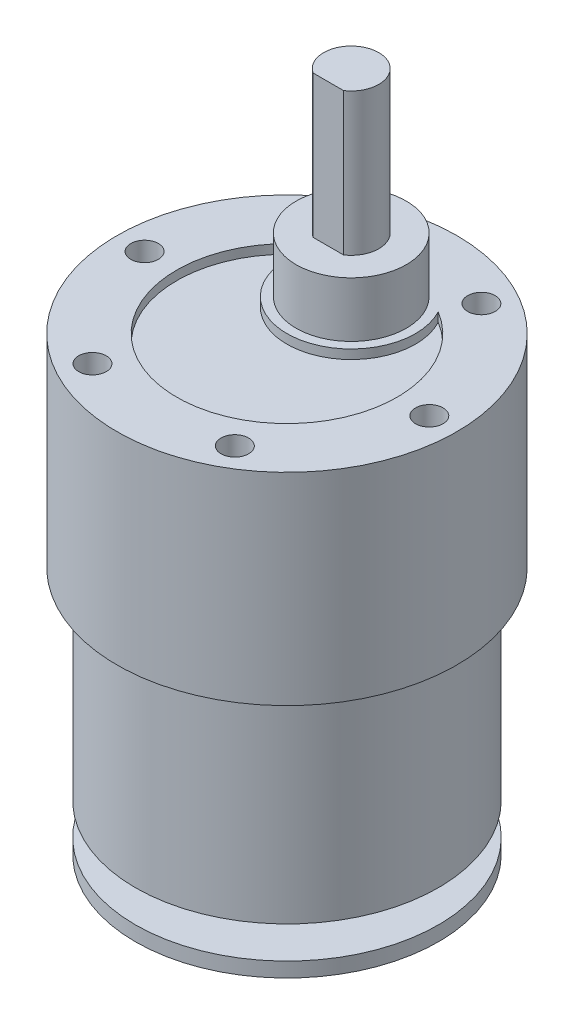
ISO-10303-21;
HEADER;
FILE_DESCRIPTION(('STEP AP214'),'2;1');
FILE_NAME('part.step','',(''),(''),'','','');
FILE_SCHEMA(('AUTOMOTIVE_DESIGN { 1 0 10303 214 1 1 1 1 }'));
ENDSEC;
DATA;
#1=APPLICATION_CONTEXT('core data for automotive mechanical design processes');
#2=APPLICATION_PROTOCOL_DEFINITION('international standard','automotive_design',2000,#1);
#3=PRODUCT_CONTEXT('',#1,'mechanical');
#4=PRODUCT('Part','Part','',(#3));
#5=PRODUCT_RELATED_PRODUCT_CATEGORY('part','',(#4));
#6=PRODUCT_DEFINITION_FORMATION('','',#4);
#7=PRODUCT_DEFINITION_CONTEXT('part definition',#1,'design');
#8=PRODUCT_DEFINITION('design','',#6,#7);
#9=PRODUCT_DEFINITION_SHAPE('','',#8);
#10=(LENGTH_UNIT() NAMED_UNIT(*) SI_UNIT(.MILLI.,.METRE.));
#11=(NAMED_UNIT(*) PLANE_ANGLE_UNIT() SI_UNIT($,.RADIAN.));
#12=(NAMED_UNIT(*) SI_UNIT($,.STERADIAN.) SOLID_ANGLE_UNIT());
#13=UNCERTAINTY_MEASURE_WITH_UNIT(LENGTH_MEASURE(1.E-05),#10,'distance_accuracy_value','');
#14=(GEOMETRIC_REPRESENTATION_CONTEXT(3) GLOBAL_UNCERTAINTY_ASSIGNED_CONTEXT((#13)) GLOBAL_UNIT_ASSIGNED_CONTEXT((#10,
#11,#12)) REPRESENTATION_CONTEXT('',''));
#15=CARTESIAN_POINT('',(0.,0.,0.));
#16=DIRECTION('',(0.,0.,1.));
#17=DIRECTION('',(1.,0.,0.));
#18=AXIS2_PLACEMENT_3D('',#15,#16,#17);
#19=CARTESIAN_POINT('',(0.,-33.5,0.));
#20=DIRECTION('',(0.,-1.,0.));
#21=DIRECTION('',(0.,0.,-1.));
#22=AXIS2_PLACEMENT_3D('',#19,#20,#21);
#23=PLANE('',#22);
#24=CARTESIAN_POINT('',(0.,-33.5,0.));
#25=DIRECTION('',(0.,-1.,0.));
#26=DIRECTION('',(0.,0.,-1.));
#27=AXIS2_PLACEMENT_3D('',#24,#25,#26);
#28=CIRCLE('',#27,6.75);
#29=CARTESIAN_POINT('',(0.,-33.5,-6.75));
#30=VERTEX_POINT('',#29);
#31=EDGE_CURVE('E20',#30,#30,#28,.F.);
#32=ORIENTED_EDGE('',*,*,#31,.F.);
#33=EDGE_LOOP('',(#32));
#34=FACE_BOUND('',#33,.T.);
#35=ADVANCED_FACE('F17',(#34),#23,.T.);
#36=CARTESIAN_POINT('',(0.,-29.,0.));
#37=DIRECTION('',(0.,-1.,0.));
#38=DIRECTION('',(0.,0.,-1.));
#39=AXIS2_PLACEMENT_3D('',#36,#37,#38);
#40=CYLINDRICAL_SURFACE('',#39,6.75);
#41=ORIENTED_EDGE('',*,*,#31,.T.);
#42=EDGE_LOOP('',(#41));
#43=FACE_BOUND('',#42,.T.);
#44=CARTESIAN_POINT('',(0.,-29.,0.));
#45=DIRECTION('',(0.,-1.,0.));
#46=DIRECTION('',(0.,0.,-1.));
#47=AXIS2_PLACEMENT_3D('',#44,#45,#46);
#48=CIRCLE('',#47,6.75);
#49=CARTESIAN_POINT('',(0.,-29.,-6.75));
#50=VERTEX_POINT('',#49);
#51=EDGE_CURVE('E159',#50,#50,#48,.T.);
#52=ORIENTED_EDGE('',*,*,#51,.T.);
#53=EDGE_LOOP('',(#52));
#54=FACE_BOUND('',#53,.T.);
#55=ADVANCED_FACE('F166',(#43,#54),#40,.T.);
#56=CARTESIAN_POINT('',(0.,-29.,0.));
#57=DIRECTION('',(0.,-1.,0.));
#58=DIRECTION('',(0.,0.,-1.));
#59=AXIS2_PLACEMENT_3D('',#56,#57,#58);
#60=PLANE('',#59);
#61=ORIENTED_EDGE('',*,*,#51,.F.);
#62=EDGE_LOOP('',(#61));
#63=FACE_BOUND('',#62,.T.);
#64=CARTESIAN_POINT('',(0.,-29.,0.));
#65=DIRECTION('',(0.,1.,0.));
#66=DIRECTION('',(0.,0.,1.));
#67=AXIS2_PLACEMENT_3D('',#64,#65,#66);
#68=CIRCLE('',#67,1.);
#69=CARTESIAN_POINT('',(0.,-29.,1.));
#70=VERTEX_POINT('',#69);
#71=EDGE_CURVE('E157',#70,#70,#68,.T.);
#72=ORIENTED_EDGE('',*,*,#71,.F.);
#73=EDGE_LOOP('',(#72));
#74=FACE_BOUND('',#73,.T.);
#75=ADVANCED_FACE('F173',(#63,#74),#60,.F.);
#76=CARTESIAN_POINT('',(0.,-33.5,0.));
#77=DIRECTION('',(0.,1.,0.));
#78=DIRECTION('',(0.,0.,1.));
#79=AXIS2_PLACEMENT_3D('',#76,#77,#78);
#80=CYLINDRICAL_SURFACE('',#79,1.);
#81=CARTESIAN_POINT('',(0.,-27.1,0.));
#82=DIRECTION('',(0.,1.,0.));
#83=DIRECTION('',(0.,0.,1.));
#84=AXIS2_PLACEMENT_3D('',#81,#82,#83);
#85=CIRCLE('',#84,1.);
#86=CARTESIAN_POINT('',(0.,-27.1,1.));
#87=VERTEX_POINT('',#86);
#88=EDGE_CURVE('E154',#87,#87,#85,.T.);
#89=ORIENTED_EDGE('',*,*,#88,.F.);
#90=EDGE_LOOP('',(#89));
#91=FACE_BOUND('',#90,.T.);
#92=ORIENTED_EDGE('',*,*,#71,.T.);
#93=EDGE_LOOP('',(#92));
#94=FACE_BOUND('',#93,.T.);
#95=ADVANCED_FACE('F286',(#91,#94),#80,.T.);
#96=CARTESIAN_POINT('',(0.,-27.1,0.));
#97=DIRECTION('',(0.,-1.,0.));
#98=DIRECTION('',(0.,0.,-1.));
#99=AXIS2_PLACEMENT_3D('',#96,#97,#98);
#100=PLANE('',#99);
#101=CARTESIAN_POINT('',(0.,-27.1,0.));
#102=DIRECTION('',(0.,1.,0.));
#103=DIRECTION('',(0.,0.,1.));
#104=AXIS2_PLACEMENT_3D('',#101,#102,#103);
#105=CIRCLE('',#104,16.5);
#106=CARTESIAN_POINT('',(0.,-27.1,16.5));
#107=VERTEX_POINT('',#106);
#108=EDGE_CURVE('E151',#107,#107,#105,.T.);
#109=ORIENTED_EDGE('',*,*,#108,.F.);
#110=EDGE_LOOP('',(#109));
#111=FACE_BOUND('',#110,.T.);
#112=ORIENTED_EDGE('',*,*,#88,.T.);
#113=EDGE_LOOP('',(#112));
#114=FACE_BOUND('',#113,.T.);
#115=ADVANCED_FACE('F282',(#111,#114),#100,.T.);
#116=CARTESIAN_POINT('',(0.,-27.1,0.));
#117=DIRECTION('',(0.,1.,0.));
#118=DIRECTION('',(0.,0.,1.));
#119=AXIS2_PLACEMENT_3D('',#116,#117,#118);
#120=CYLINDRICAL_SURFACE('',#119,16.5);
#121=ORIENTED_EDGE('',*,*,#108,.T.);
#122=EDGE_LOOP('',(#121));
#123=FACE_BOUND('',#122,.T.);
#124=CARTESIAN_POINT('',(0.,-25.5,0.));
#125=DIRECTION('',(0.,1.,0.));
#126=DIRECTION('',(0.,0.,1.));
#127=AXIS2_PLACEMENT_3D('',#124,#125,#126);
#128=CIRCLE('',#127,16.5);
#129=CARTESIAN_POINT('',(0.,-25.5,16.5));
#130=VERTEX_POINT('',#129);
#131=EDGE_CURVE('E71',#130,#130,#128,.F.);
#132=ORIENTED_EDGE('',*,*,#131,.T.);
#133=EDGE_LOOP('',(#132));
#134=FACE_BOUND('',#133,.T.);
#135=ADVANCED_FACE('F279',(#123,#134),#120,.T.);
#136=CARTESIAN_POINT('',(0.,43.5,-7.));
#137=DIRECTION('',(0.,1.,0.));
#138=DIRECTION('',(0.,0.,1.));
#139=AXIS2_PLACEMENT_3D('',#136,#137,#138);
#140=PLANE('',#139);
#141=CARTESIAN_POINT('',(0.,43.5,-7.));
#142=DIRECTION('',(0.,-1.,0.));
#143=DIRECTION('',(0.,0.,-1.));
#144=AXIS2_PLACEMENT_3D('',#141,#142,#143);
#145=CIRCLE('',#144,3.);
#146=CARTESIAN_POINT('',(-1.6583123951777,43.5,-4.5));
#147=VERTEX_POINT('',#146);
#148=CARTESIAN_POINT('',(1.6583123951777,43.5,-4.5));
#149=VERTEX_POINT('',#148);
#150=EDGE_CURVE('E59',#147,#149,#145,.T.);
#151=ORIENTED_EDGE('',*,*,#150,.F.);
#152=DIRECTION('',(-1.,0.,0.));
#153=VECTOR('',#152,1.);
#154=CARTESIAN_POINT('',(1.6583123951777,43.5,-4.5));
#155=LINE('',#154,#153);
#156=EDGE_CURVE('E56',#147,#149,#155,.F.);
#157=ORIENTED_EDGE('',*,*,#156,.T.);
#158=EDGE_LOOP('',(#151,#157));
#159=FACE_BOUND('',#158,.T.);
#160=ADVANCED_FACE('F60',(#159),#140,.T.);
#161=CARTESIAN_POINT('',(0.,-25.5,0.));
#162=DIRECTION('',(0.,-1.,0.));
#163=DIRECTION('',(0.,0.,-1.));
#164=AXIS2_PLACEMENT_3D('',#161,#162,#163);
#165=PLANE('',#164);
#166=ORIENTED_EDGE('',*,*,#131,.F.);
#167=EDGE_LOOP('',(#166));
#168=FACE_BOUND('',#167,.T.);
#169=CARTESIAN_POINT('',(0.,-25.5,0.));
#170=DIRECTION('',(0.,1.,0.));
#171=DIRECTION('',(0.,0.,1.));
#172=AXIS2_PLACEMENT_3D('',#169,#170,#171);
#173=CIRCLE('',#172,4.);
#174=CARTESIAN_POINT('',(0.,-25.5,4.));
#175=VERTEX_POINT('',#174);
#176=EDGE_CURVE('E146',#175,#175,#173,.T.);
#177=ORIENTED_EDGE('',*,*,#176,.F.);
#178=EDGE_LOOP('',(#177));
#179=FACE_BOUND('',#178,.T.);
#180=ADVANCED_FACE('F273',(#168,#179),#165,.F.);
#181=CARTESIAN_POINT('',(1.6583123951777,43.5,-4.5));
#182=DIRECTION('',(0.,0.,-1.));
#183=DIRECTION('',(-1.,0.,0.));
#184=AXIS2_PLACEMENT_3D('',#181,#182,#183);
#185=PLANE('',#184);
#186=DIRECTION('',(0.,-1.,0.));
#187=VECTOR('',#186,1.);
#188=CARTESIAN_POINT('',(1.6583123951777,43.5,-4.5));
#189=LINE('',#188,#187);
#190=CARTESIAN_POINT('',(1.6583123951777,28.,-4.5));
#191=VERTEX_POINT('',#190);
#192=EDGE_CURVE('E64',#149,#191,#189,.T.);
#193=ORIENTED_EDGE('',*,*,#192,.F.);
#194=ORIENTED_EDGE('',*,*,#156,.F.);
#195=DIRECTION('',(0.,-1.,0.));
#196=VECTOR('',#195,1.);
#197=CARTESIAN_POINT('',(-1.6583123951777,43.5,-4.5));
#198=LINE('',#197,#196);
#199=CARTESIAN_POINT('',(-1.6583123951777,28.,-4.5));
#200=VERTEX_POINT('',#199);
#201=EDGE_CURVE('E65',#200,#147,#198,.F.);
#202=ORIENTED_EDGE('',*,*,#201,.F.);
#203=DIRECTION('',(1.,0.,0.));
#204=VECTOR('',#203,1.);
#205=CARTESIAN_POINT('',(0.,28.,-4.5));
#206=LINE('',#205,#204);
#207=EDGE_CURVE('E145',#191,#200,#206,.F.);
#208=ORIENTED_EDGE('',*,*,#207,.F.);
#209=EDGE_LOOP('',(#193,#194,#202,#208));
#210=FACE_BOUND('',#209,.T.);
#211=ADVANCED_FACE('F69',(#210),#185,.F.);
#212=CARTESIAN_POINT('',(0.,43.5,-7.));
#213=DIRECTION('',(0.,-1.,0.));
#214=DIRECTION('',(0.,0.,-1.));
#215=AXIS2_PLACEMENT_3D('',#212,#213,#214);
#216=CYLINDRICAL_SURFACE('',#215,3.);
#217=ORIENTED_EDGE('',*,*,#192,.T.);
#218=CARTESIAN_POINT('',(0.,28.,-7.));
#219=DIRECTION('',(0.,-1.,0.));
#220=DIRECTION('',(0.,0.,-1.));
#221=AXIS2_PLACEMENT_3D('',#218,#219,#220);
#222=CIRCLE('',#221,3.);
#223=EDGE_CURVE('E75',#200,#191,#222,.T.);
#224=ORIENTED_EDGE('',*,*,#223,.F.);
#225=ORIENTED_EDGE('',*,*,#201,.T.);
#226=ORIENTED_EDGE('',*,*,#150,.T.);
#227=EDGE_LOOP('',(#217,#224,#225,#226));
#228=FACE_BOUND('',#227,.T.);
#229=ADVANCED_FACE('F73',(#228),#216,.T.);
#230=CARTESIAN_POINT('',(0.,-25.5,0.));
#231=DIRECTION('',(0.,1.,0.));
#232=DIRECTION('',(0.,0.,1.));
#233=AXIS2_PLACEMENT_3D('',#230,#231,#232);
#234=CYLINDRICAL_SURFACE('',#233,4.);
#235=CARTESIAN_POINT('',(0.,-22.,0.));
#236=DIRECTION('',(0.,1.,0.));
#237=DIRECTION('',(0.,0.,1.));
#238=AXIS2_PLACEMENT_3D('',#235,#236,#237);
#239=CIRCLE('',#238,4.);
#240=CARTESIAN_POINT('',(0.,-22.,4.));
#241=VERTEX_POINT('',#240);
#242=EDGE_CURVE('E141',#241,#241,#239,.T.);
#243=ORIENTED_EDGE('',*,*,#242,.F.);
#244=EDGE_LOOP('',(#243));
#245=FACE_BOUND('',#244,.T.);
#246=ORIENTED_EDGE('',*,*,#176,.T.);
#247=EDGE_LOOP('',(#246));
#248=FACE_BOUND('',#247,.T.);
#249=ADVANCED_FACE('F264',(#245,#248),#234,.T.);
#250=CARTESIAN_POINT('',(0.,21.,-3.5));
#251=DIRECTION('',(0.,1.,0.));
#252=DIRECTION('',(0.,0.,1.));
#253=AXIS2_PLACEMENT_3D('',#250,#251,#252);
#254=PLANE('',#253);
#255=CARTESIAN_POINT('',(0.,21.,0.));
#256=DIRECTION('',(0.,1.,0.));
#257=DIRECTION('',(0.,0.,1.));
#258=AXIS2_PLACEMENT_3D('',#255,#256,#257);
#259=CIRCLE('',#258,12.);
#260=CARTESIAN_POINT('',(-6.18094504365255,21.,-10.2857142857143));
#261=VERTEX_POINT('',#260);
#262=CARTESIAN_POINT('',(6.18094504365255,21.,-10.2857142857143));
#263=VERTEX_POINT('',#262);
#264=EDGE_CURVE('E138',#261,#263,#259,.T.);
#265=ORIENTED_EDGE('',*,*,#264,.T.);
#266=CARTESIAN_POINT('',(0.,21.,-7.));
#267=DIRECTION('',(0.,1.,0.));
#268=DIRECTION('',(0.,0.,1.));
#269=AXIS2_PLACEMENT_3D('',#266,#267,#268);
#270=CIRCLE('',#269,7.);
#271=EDGE_CURVE('E135',#261,#263,#270,.T.);
#272=ORIENTED_EDGE('',*,*,#271,.F.);
#273=EDGE_LOOP('',(#265,#272));
#274=FACE_BOUND('',#273,.T.);
#275=ADVANCED_FACE('F260',(#274),#254,.T.);
#276=CARTESIAN_POINT('',(0.,28.,-7.));
#277=DIRECTION('',(0.,1.,0.));
#278=DIRECTION('',(0.,0.,1.));
#279=AXIS2_PLACEMENT_3D('',#276,#277,#278);
#280=PLANE('',#279);
#281=ORIENTED_EDGE('',*,*,#207,.T.);
#282=ORIENTED_EDGE('',*,*,#223,.T.);
#283=EDGE_LOOP('',(#281,#282));
#284=FACE_BOUND('',#283,.T.);
#285=CARTESIAN_POINT('',(0.,28.,-7.));
#286=DIRECTION('',(0.,1.,0.));
#287=DIRECTION('',(0.,0.,1.));
#288=AXIS2_PLACEMENT_3D('',#285,#286,#287);
#289=CIRCLE('',#288,6.);
#290=CARTESIAN_POINT('',(0.,28.,-1.));
#291=VERTEX_POINT('',#290);
#292=EDGE_CURVE('E132',#291,#291,#289,.F.);
#293=ORIENTED_EDGE('',*,*,#292,.F.);
#294=EDGE_LOOP('',(#293));
#295=FACE_BOUND('',#294,.T.);
#296=ADVANCED_FACE('F256',(#284,#295),#280,.T.);
#297=CARTESIAN_POINT('',(0.,15.,0.));
#298=DIRECTION('',(0.,-1.,0.));
#299=DIRECTION('',(0.,0.,-1.));
#300=AXIS2_PLACEMENT_3D('',#297,#298,#299);
#301=PLANE('',#300);
#302=CARTESIAN_POINT('',(7.75000000000016,15.,-13.4233937586587));
#303=DIRECTION('',(0.,-1.,0.));
#304=DIRECTION('',(0.,0.,-1.));
#305=AXIS2_PLACEMENT_3D('',#302,#303,#304);
#306=CIRCLE('',#305,1.5);
#307=CARTESIAN_POINT('',(7.75000000000016,15.,-14.9233937586587));
#308=VERTEX_POINT('',#307);
#309=EDGE_CURVE('E129',#308,#308,#306,.F.);
#310=ORIENTED_EDGE('',*,*,#309,.T.);
#311=EDGE_LOOP('',(#310));
#312=FACE_BOUND('',#311,.T.);
#313=ADVANCED_FACE('F252',(#312),#301,.F.);
#314=CARTESIAN_POINT('',(0.,15.,0.));
#315=DIRECTION('',(0.,-1.,0.));
#316=DIRECTION('',(0.,0.,-1.));
#317=AXIS2_PLACEMENT_3D('',#314,#315,#316);
#318=PLANE('',#317);
#319=CARTESIAN_POINT('',(-7.74999999999987,15.,-13.4233937586589));
#320=DIRECTION('',(0.,-1.,0.));
#321=DIRECTION('',(0.,0.,-1.));
#322=AXIS2_PLACEMENT_3D('',#319,#320,#321);
#323=CIRCLE('',#322,1.5);
#324=CARTESIAN_POINT('',(-7.74999999999987,15.,-14.9233937586589));
#325=VERTEX_POINT('',#324);
#326=EDGE_CURVE('E126',#325,#325,#323,.F.);
#327=ORIENTED_EDGE('',*,*,#326,.T.);
#328=EDGE_LOOP('',(#327));
#329=FACE_BOUND('',#328,.T.);
#330=ADVANCED_FACE('F248',(#329),#318,.F.);
#331=CARTESIAN_POINT('',(0.,15.,0.));
#332=DIRECTION('',(0.,-1.,0.));
#333=DIRECTION('',(0.,0.,-1.));
#334=AXIS2_PLACEMENT_3D('',#331,#332,#333);
#335=PLANE('',#334);
#336=CARTESIAN_POINT('',(-15.5,15.,-1.08235921504137E-13));
#337=DIRECTION('',(0.,-1.,0.));
#338=DIRECTION('',(0.,0.,-1.));
#339=AXIS2_PLACEMENT_3D('',#336,#337,#338);
#340=CIRCLE('',#339,1.5);
#341=CARTESIAN_POINT('',(-15.5,15.,-1.50000000000011));
#342=VERTEX_POINT('',#341);
#343=EDGE_CURVE('E123',#342,#342,#340,.F.);
#344=ORIENTED_EDGE('',*,*,#343,.T.);
#345=EDGE_LOOP('',(#344));
#346=FACE_BOUND('',#345,.T.);
#347=ADVANCED_FACE('F244',(#346),#335,.F.);
#348=CARTESIAN_POINT('',(0.,15.,0.));
#349=DIRECTION('',(0.,-1.,0.));
#350=DIRECTION('',(0.,0.,-1.));
#351=AXIS2_PLACEMENT_3D('',#348,#349,#350);
#352=PLANE('',#351);
#353=CARTESIAN_POINT('',(-7.75000000000006,15.,13.4233937586588));
#354=DIRECTION('',(0.,-1.,0.));
#355=DIRECTION('',(0.,0.,-1.));
#356=AXIS2_PLACEMENT_3D('',#353,#354,#355);
#357=CIRCLE('',#356,1.5);
#358=CARTESIAN_POINT('',(-7.75000000000006,15.,11.9233937586588));
#359=VERTEX_POINT('',#358);
#360=EDGE_CURVE('E120',#359,#359,#357,.F.);
#361=ORIENTED_EDGE('',*,*,#360,.T.);
#362=EDGE_LOOP('',(#361));
#363=FACE_BOUND('',#362,.T.);
#364=ADVANCED_FACE('F240',(#363),#352,.F.);
#365=CARTESIAN_POINT('',(0.,15.,0.));
#366=DIRECTION('',(0.,-1.,0.));
#367=DIRECTION('',(0.,0.,-1.));
#368=AXIS2_PLACEMENT_3D('',#365,#366,#367);
#369=PLANE('',#368);
#370=CARTESIAN_POINT('',(7.74999999999997,15.,13.4233937586588));
#371=DIRECTION('',(0.,-1.,0.));
#372=DIRECTION('',(0.,0.,-1.));
#373=AXIS2_PLACEMENT_3D('',#370,#371,#372);
#374=CIRCLE('',#373,1.5);
#375=CARTESIAN_POINT('',(7.74999999999997,15.,11.9233937586588));
#376=VERTEX_POINT('',#375);
#377=EDGE_CURVE('E117',#376,#376,#374,.F.);
#378=ORIENTED_EDGE('',*,*,#377,.T.);
#379=EDGE_LOOP('',(#378));
#380=FACE_BOUND('',#379,.T.);
#381=ADVANCED_FACE('F236',(#380),#369,.F.);
#382=CARTESIAN_POINT('',(0.,15.,0.));
#383=DIRECTION('',(0.,-1.,0.));
#384=DIRECTION('',(0.,0.,-1.));
#385=AXIS2_PLACEMENT_3D('',#382,#383,#384);
#386=PLANE('',#385);
#387=CARTESIAN_POINT('',(15.5,15.,0.));
#388=DIRECTION('',(0.,-1.,0.));
#389=DIRECTION('',(0.,0.,-1.));
#390=AXIS2_PLACEMENT_3D('',#387,#388,#389);
#391=CIRCLE('',#390,1.5);
#392=CARTESIAN_POINT('',(15.5,15.,-1.5));
#393=VERTEX_POINT('',#392);
#394=EDGE_CURVE('E114',#393,#393,#391,.F.);
#395=ORIENTED_EDGE('',*,*,#394,.T.);
#396=EDGE_LOOP('',(#395));
#397=FACE_BOUND('',#396,.T.);
#398=ADVANCED_FACE('F232',(#397),#386,.F.);
#399=CARTESIAN_POINT('',(0.,-22.,0.));
#400=DIRECTION('',(0.,-1.,0.));
#401=DIRECTION('',(0.,0.,-1.));
#402=AXIS2_PLACEMENT_3D('',#399,#400,#401);
#403=PLANE('',#402);
#404=CARTESIAN_POINT('',(0.,-22.,0.));
#405=DIRECTION('',(0.,1.,0.));
#406=DIRECTION('',(0.,0.,1.));
#407=AXIS2_PLACEMENT_3D('',#404,#405,#406);
#408=CIRCLE('',#407,16.5);
#409=CARTESIAN_POINT('',(0.,-22.,16.5));
#410=VERTEX_POINT('',#409);
#411=EDGE_CURVE('E111',#410,#410,#408,.T.);
#412=ORIENTED_EDGE('',*,*,#411,.F.);
#413=EDGE_LOOP('',(#412));
#414=FACE_BOUND('',#413,.T.);
#415=ORIENTED_EDGE('',*,*,#242,.T.);
#416=EDGE_LOOP('',(#415));
#417=FACE_BOUND('',#416,.T.);
#418=ADVANCED_FACE('F229',(#414,#417),#403,.T.);
#419=CARTESIAN_POINT('',(0.,21.,0.));
#420=DIRECTION('',(0.,1.,0.));
#421=DIRECTION('',(0.,0.,1.));
#422=AXIS2_PLACEMENT_3D('',#419,#420,#421);
#423=CYLINDRICAL_SURFACE('',#422,12.);
#424=ORIENTED_EDGE('',*,*,#264,.F.);
#425=DIRECTION('',(0.,1.,0.));
#426=VECTOR('',#425,1.);
#427=CARTESIAN_POINT('',(-6.18094504365255,21.,-10.2857142857143));
#428=LINE('',#427,#426);
#429=CARTESIAN_POINT('',(-6.18094504365255,22.,-10.2857142857143));
#430=VERTEX_POINT('',#429);
#431=EDGE_CURVE('E35',#430,#261,#428,.F.);
#432=ORIENTED_EDGE('',*,*,#431,.F.);
#433=CARTESIAN_POINT('',(0.,22.,0.));
#434=DIRECTION('',(0.,1.,0.));
#435=DIRECTION('',(0.,0.,1.));
#436=AXIS2_PLACEMENT_3D('',#433,#434,#435);
#437=CIRCLE('',#436,12.);
#438=CARTESIAN_POINT('',(6.18094504365255,22.,-10.2857142857143));
#439=VERTEX_POINT('',#438);
#440=EDGE_CURVE('E108',#439,#430,#437,.F.);
#441=ORIENTED_EDGE('',*,*,#440,.F.);
#442=DIRECTION('',(0.,1.,0.));
#443=VECTOR('',#442,1.);
#444=CARTESIAN_POINT('',(6.18094504365255,21.,-10.2857142857143));
#445=LINE('',#444,#443);
#446=EDGE_CURVE('E140',#263,#439,#445,.T.);
#447=ORIENTED_EDGE('',*,*,#446,.F.);
#448=EDGE_LOOP('',(#424,#432,#441,#447));
#449=FACE_BOUND('',#448,.T.);
#450=ADVANCED_FACE('F225',(#449),#423,.F.);
#451=CARTESIAN_POINT('',(0.,21.,-7.));
#452=DIRECTION('',(0.,1.,0.));
#453=DIRECTION('',(0.,0.,1.));
#454=AXIS2_PLACEMENT_3D('',#451,#452,#453);
#455=CYLINDRICAL_SURFACE('',#454,7.);
#456=CARTESIAN_POINT('',(0.,22.,-7.));
#457=DIRECTION('',(0.,1.,0.));
#458=DIRECTION('',(0.,0.,1.));
#459=AXIS2_PLACEMENT_3D('',#456,#457,#458);
#460=CIRCLE('',#459,7.);
#461=EDGE_CURVE('E106',#430,#439,#460,.T.);
#462=ORIENTED_EDGE('',*,*,#461,.F.);
#463=ORIENTED_EDGE('',*,*,#431,.T.);
#464=ORIENTED_EDGE('',*,*,#271,.T.);
#465=ORIENTED_EDGE('',*,*,#446,.T.);
#466=EDGE_LOOP('',(#462,#463,#464,#465));
#467=FACE_BOUND('',#466,.T.);
#468=ADVANCED_FACE('F221',(#467),#455,.T.);
#469=CARTESIAN_POINT('',(0.,0.,-7.));
#470=DIRECTION('',(0.,1.,0.));
#471=DIRECTION('',(0.,0.,1.));
#472=AXIS2_PLACEMENT_3D('',#469,#470,#471);
#473=CYLINDRICAL_SURFACE('',#472,6.);
#474=CARTESIAN_POINT('',(0.,22.,-7.));
#475=DIRECTION('',(0.,1.,0.));
#476=DIRECTION('',(0.,0.,1.));
#477=AXIS2_PLACEMENT_3D('',#474,#475,#476);
#478=CIRCLE('',#477,6.);
#479=CARTESIAN_POINT('',(0.,22.,-1.));
#480=VERTEX_POINT('',#479);
#481=EDGE_CURVE('E103',#480,#480,#478,.F.);
#482=ORIENTED_EDGE('',*,*,#481,.F.);
#483=EDGE_LOOP('',(#482));
#484=FACE_BOUND('',#483,.T.);
#485=ORIENTED_EDGE('',*,*,#292,.T.);
#486=EDGE_LOOP('',(#485));
#487=FACE_BOUND('',#486,.T.);
#488=ADVANCED_FACE('F217',(#484,#487),#473,.T.);
#489=CARTESIAN_POINT('',(7.75000000000016,22.,-13.4233937586587));
#490=DIRECTION('',(0.,-1.,0.));
#491=DIRECTION('',(0.,0.,-1.));
#492=AXIS2_PLACEMENT_3D('',#489,#490,#491);
#493=CYLINDRICAL_SURFACE('',#492,1.5);
#494=CARTESIAN_POINT('',(7.75000000000016,22.,-13.4233937586587));
#495=DIRECTION('',(0.,-1.,0.));
#496=DIRECTION('',(0.,0.,-1.));
#497=AXIS2_PLACEMENT_3D('',#494,#495,#496);
#498=CIRCLE('',#497,1.5);
#499=CARTESIAN_POINT('',(7.75000000000016,22.,-14.9233937586587));
#500=VERTEX_POINT('',#499);
#501=EDGE_CURVE('E100',#500,#500,#498,.T.);
#502=ORIENTED_EDGE('',*,*,#501,.F.);
#503=EDGE_LOOP('',(#502));
#504=FACE_BOUND('',#503,.T.);
#505=ORIENTED_EDGE('',*,*,#309,.F.);
#506=EDGE_LOOP('',(#505));
#507=FACE_BOUND('',#506,.T.);
#508=ADVANCED_FACE('F213',(#504,#507),#493,.F.);
#509=CARTESIAN_POINT('',(-7.74999999999987,22.,-13.4233937586589));
#510=DIRECTION('',(0.,-1.,0.));
#511=DIRECTION('',(0.,0.,-1.));
#512=AXIS2_PLACEMENT_3D('',#509,#510,#511);
#513=CYLINDRICAL_SURFACE('',#512,1.5);
#514=CARTESIAN_POINT('',(-7.74999999999987,22.,-13.4233937586589));
#515=DIRECTION('',(0.,-1.,0.));
#516=DIRECTION('',(0.,0.,-1.));
#517=AXIS2_PLACEMENT_3D('',#514,#515,#516);
#518=CIRCLE('',#517,1.5);
#519=CARTESIAN_POINT('',(-7.74999999999987,22.,-14.9233937586589));
#520=VERTEX_POINT('',#519);
#521=EDGE_CURVE('E97',#520,#520,#518,.T.);
#522=ORIENTED_EDGE('',*,*,#521,.F.);
#523=EDGE_LOOP('',(#522));
#524=FACE_BOUND('',#523,.T.);
#525=ORIENTED_EDGE('',*,*,#326,.F.);
#526=EDGE_LOOP('',(#525));
#527=FACE_BOUND('',#526,.T.);
#528=ADVANCED_FACE('F209',(#524,#527),#513,.F.);
#529=CARTESIAN_POINT('',(-15.5,22.,-1.08235921504137E-13));
#530=DIRECTION('',(0.,-1.,0.));
#531=DIRECTION('',(0.,0.,-1.));
#532=AXIS2_PLACEMENT_3D('',#529,#530,#531);
#533=CYLINDRICAL_SURFACE('',#532,1.5);
#534=CARTESIAN_POINT('',(-15.5,22.,-1.08235921504137E-13));
#535=DIRECTION('',(0.,-1.,0.));
#536=DIRECTION('',(0.,0.,-1.));
#537=AXIS2_PLACEMENT_3D('',#534,#535,#536);
#538=CIRCLE('',#537,1.5);
#539=CARTESIAN_POINT('',(-15.5,22.,-1.50000000000011));
#540=VERTEX_POINT('',#539);
#541=EDGE_CURVE('E94',#540,#540,#538,.T.);
#542=ORIENTED_EDGE('',*,*,#541,.F.);
#543=EDGE_LOOP('',(#542));
#544=FACE_BOUND('',#543,.T.);
#545=ORIENTED_EDGE('',*,*,#343,.F.);
#546=EDGE_LOOP('',(#545));
#547=FACE_BOUND('',#546,.T.);
#548=ADVANCED_FACE('F205',(#544,#547),#533,.F.);
#549=CARTESIAN_POINT('',(-7.75000000000006,22.,13.4233937586588));
#550=DIRECTION('',(0.,-1.,0.));
#551=DIRECTION('',(0.,0.,-1.));
#552=AXIS2_PLACEMENT_3D('',#549,#550,#551);
#553=CYLINDRICAL_SURFACE('',#552,1.5);
#554=CARTESIAN_POINT('',(-7.75000000000006,22.,13.4233937586588));
#555=DIRECTION('',(0.,-1.,0.));
#556=DIRECTION('',(0.,0.,-1.));
#557=AXIS2_PLACEMENT_3D('',#554,#555,#556);
#558=CIRCLE('',#557,1.5);
#559=CARTESIAN_POINT('',(-7.75000000000006,22.,11.9233937586588));
#560=VERTEX_POINT('',#559);
#561=EDGE_CURVE('E91',#560,#560,#558,.T.);
#562=ORIENTED_EDGE('',*,*,#561,.F.);
#563=EDGE_LOOP('',(#562));
#564=FACE_BOUND('',#563,.T.);
#565=ORIENTED_EDGE('',*,*,#360,.F.);
#566=EDGE_LOOP('',(#565));
#567=FACE_BOUND('',#566,.T.);
#568=ADVANCED_FACE('F201',(#564,#567),#553,.F.);
#569=CARTESIAN_POINT('',(7.74999999999997,22.,13.4233937586588));
#570=DIRECTION('',(0.,-1.,0.));
#571=DIRECTION('',(0.,0.,-1.));
#572=AXIS2_PLACEMENT_3D('',#569,#570,#571);
#573=CYLINDRICAL_SURFACE('',#572,1.5);
#574=CARTESIAN_POINT('',(7.74999999999997,22.,13.4233937586588));
#575=DIRECTION('',(0.,-1.,0.));
#576=DIRECTION('',(0.,0.,-1.));
#577=AXIS2_PLACEMENT_3D('',#574,#575,#576);
#578=CIRCLE('',#577,1.5);
#579=CARTESIAN_POINT('',(7.74999999999997,22.,11.9233937586588));
#580=VERTEX_POINT('',#579);
#581=EDGE_CURVE('E88',#580,#580,#578,.T.);
#582=ORIENTED_EDGE('',*,*,#581,.F.);
#583=EDGE_LOOP('',(#582));
#584=FACE_BOUND('',#583,.T.);
#585=ORIENTED_EDGE('',*,*,#377,.F.);
#586=EDGE_LOOP('',(#585));
#587=FACE_BOUND('',#586,.T.);
#588=ADVANCED_FACE('F197',(#584,#587),#573,.F.);
#589=CARTESIAN_POINT('',(15.5,22.,0.));
#590=DIRECTION('',(0.,-1.,0.));
#591=DIRECTION('',(0.,0.,-1.));
#592=AXIS2_PLACEMENT_3D('',#589,#590,#591);
#593=CYLINDRICAL_SURFACE('',#592,1.5);
#594=CARTESIAN_POINT('',(15.5,22.,0.));
#595=DIRECTION('',(0.,-1.,0.));
#596=DIRECTION('',(0.,0.,-1.));
#597=AXIS2_PLACEMENT_3D('',#594,#595,#596);
#598=CIRCLE('',#597,1.5);
#599=CARTESIAN_POINT('',(15.5,22.,-1.5));
#600=VERTEX_POINT('',#599);
#601=EDGE_CURVE('E85',#600,#600,#598,.T.);
#602=ORIENTED_EDGE('',*,*,#601,.F.);
#603=EDGE_LOOP('',(#602));
#604=FACE_BOUND('',#603,.T.);
#605=ORIENTED_EDGE('',*,*,#394,.F.);
#606=EDGE_LOOP('',(#605));
#607=FACE_BOUND('',#606,.T.);
#608=ADVANCED_FACE('F193',(#604,#607),#593,.F.);
#609=CARTESIAN_POINT('',(0.,-22.,0.));
#610=DIRECTION('',(0.,1.,0.));
#611=DIRECTION('',(0.,0.,1.));
#612=AXIS2_PLACEMENT_3D('',#609,#610,#611);
#613=CYLINDRICAL_SURFACE('',#612,16.5);
#614=ORIENTED_EDGE('',*,*,#411,.T.);
#615=EDGE_LOOP('',(#614));
#616=FACE_BOUND('',#615,.T.);
#617=CARTESIAN_POINT('',(0.,0.,0.));
#618=DIRECTION('',(0.,1.,0.));
#619=DIRECTION('',(0.,0.,1.));
#620=AXIS2_PLACEMENT_3D('',#617,#618,#619);
#621=CIRCLE('',#620,16.5);
#622=CARTESIAN_POINT('',(0.,0.,16.5));
#623=VERTEX_POINT('',#622);
#624=EDGE_CURVE('E82',#623,#623,#621,.F.);
#625=ORIENTED_EDGE('',*,*,#624,.T.);
#626=EDGE_LOOP('',(#625));
#627=FACE_BOUND('',#626,.T.);
#628=ADVANCED_FACE('F189',(#616,#627),#613,.T.);
#629=CARTESIAN_POINT('',(0.,22.,0.));
#630=DIRECTION('',(0.,1.,0.));
#631=DIRECTION('',(0.,0.,1.));
#632=AXIS2_PLACEMENT_3D('',#629,#630,#631);
#633=PLANE('',#632);
#634=CARTESIAN_POINT('',(0.,22.,0.));
#635=DIRECTION('',(0.,-1.,0.));
#636=DIRECTION('',(0.,0.,-1.));
#637=AXIS2_PLACEMENT_3D('',#634,#635,#636);
#638=CIRCLE('',#637,18.5);
#639=CARTESIAN_POINT('',(0.,22.,-18.5));
#640=VERTEX_POINT('',#639);
#641=EDGE_CURVE('E26',#640,#640,#638,.T.);
#642=ORIENTED_EDGE('',*,*,#641,.F.);
#643=EDGE_LOOP('',(#642));
#644=FACE_BOUND('',#643,.T.);
#645=ORIENTED_EDGE('',*,*,#601,.T.);
#646=EDGE_LOOP('',(#645));
#647=FACE_BOUND('',#646,.T.);
#648=ORIENTED_EDGE('',*,*,#581,.T.);
#649=EDGE_LOOP('',(#648));
#650=FACE_BOUND('',#649,.T.);
#651=ORIENTED_EDGE('',*,*,#561,.T.);
#652=EDGE_LOOP('',(#651));
#653=FACE_BOUND('',#652,.T.);
#654=ORIENTED_EDGE('',*,*,#541,.T.);
#655=EDGE_LOOP('',(#654));
#656=FACE_BOUND('',#655,.T.);
#657=ORIENTED_EDGE('',*,*,#521,.T.);
#658=EDGE_LOOP('',(#657));
#659=FACE_BOUND('',#658,.T.);
#660=ORIENTED_EDGE('',*,*,#501,.T.);
#661=EDGE_LOOP('',(#660));
#662=FACE_BOUND('',#661,.T.);
#663=ORIENTED_EDGE('',*,*,#481,.T.);
#664=EDGE_LOOP('',(#663));
#665=FACE_BOUND('',#664,.T.);
#666=ORIENTED_EDGE('',*,*,#440,.T.);
#667=ORIENTED_EDGE('',*,*,#461,.T.);
#668=EDGE_LOOP('',(#666,#667));
#669=FACE_BOUND('',#668,.T.);
#670=ADVANCED_FACE('F182',(#644,#647,#650,#653,#656,#659,#662,#665,#669),#633,.T.);
#671=CARTESIAN_POINT('',(0.,0.,0.));
#672=DIRECTION('',(0.,1.,0.));
#673=DIRECTION('',(0.,0.,1.));
#674=AXIS2_PLACEMENT_3D('',#671,#672,#673);
#675=PLANE('',#674);
#676=CARTESIAN_POINT('',(0.,0.,0.));
#677=DIRECTION('',(0.,-1.,0.));
#678=DIRECTION('',(0.,0.,-1.));
#679=AXIS2_PLACEMENT_3D('',#676,#677,#678);
#680=CIRCLE('',#679,18.5);
#681=CARTESIAN_POINT('',(0.,0.,-18.5));
#682=VERTEX_POINT('',#681);
#683=EDGE_CURVE('E11',#682,#682,#680,.F.);
#684=ORIENTED_EDGE('',*,*,#683,.F.);
#685=EDGE_LOOP('',(#684));
#686=FACE_BOUND('',#685,.T.);
#687=ORIENTED_EDGE('',*,*,#624,.F.);
#688=EDGE_LOOP('',(#687));
#689=FACE_BOUND('',#688,.T.);
#690=ADVANCED_FACE('F176',(#686,#689),#675,.F.);
#691=CARTESIAN_POINT('',(0.,22.,0.));
#692=DIRECTION('',(0.,-1.,0.));
#693=DIRECTION('',(0.,0.,-1.));
#694=AXIS2_PLACEMENT_3D('',#691,#692,#693);
#695=CYLINDRICAL_SURFACE('',#694,18.5);
#696=ORIENTED_EDGE('',*,*,#683,.T.);
#697=EDGE_LOOP('',(#696));
#698=FACE_BOUND('',#697,.T.);
#699=ORIENTED_EDGE('',*,*,#641,.T.);
#700=EDGE_LOOP('',(#699));
#701=FACE_BOUND('',#700,.T.);
#702=ADVANCED_FACE('F174',(#698,#701),#695,.T.);
#703=CLOSED_SHELL('',(#35,#55,#75,#95,#115,#135,#160,#180,#211,#229,#249,#275,#296,#313,#330,
#347,#364,#381,#398,#418,#450,#468,#488,#508,#528,#548,#568,#588,#608,#628,#670,#690,#702));
#704=MANIFOLD_SOLID_BREP('B1',#703);
#705=ADVANCED_BREP_SHAPE_REPRESENTATION('',(#18,#704),#14);
#706=SHAPE_DEFINITION_REPRESENTATION(#9,#705);
ENDSEC;
END-ISO-10303-21;
